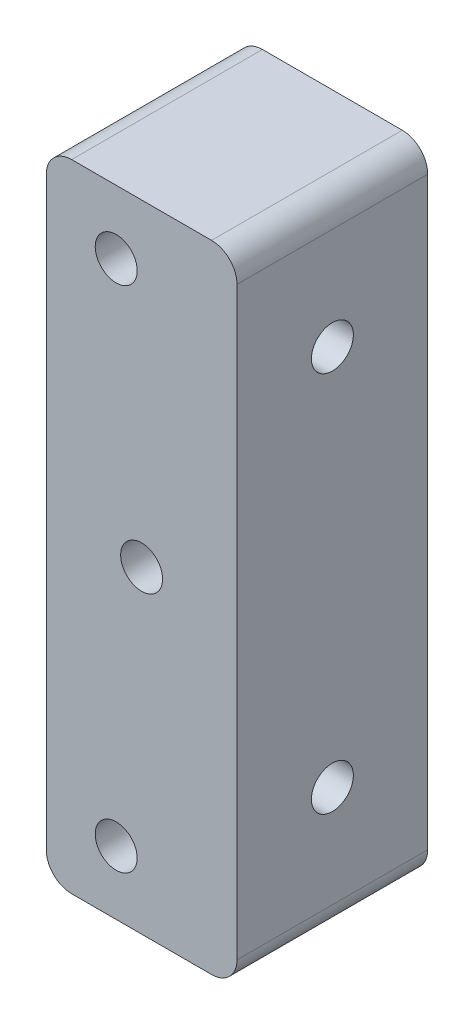
ISO-10303-21;
HEADER;
FILE_DESCRIPTION(('STEP AP214'),'2;1');
FILE_NAME('part.step','',(''),(''),'','','');
FILE_SCHEMA(('AUTOMOTIVE_DESIGN { 1 0 10303 214 1 1 1 1 }'));
ENDSEC;
DATA;
#1=APPLICATION_CONTEXT('core data for automotive mechanical design processes');
#2=APPLICATION_PROTOCOL_DEFINITION('international standard','automotive_design',2000,#1);
#3=PRODUCT_CONTEXT('',#1,'mechanical');
#4=PRODUCT('Part','Part','',(#3));
#5=PRODUCT_RELATED_PRODUCT_CATEGORY('part','',(#4));
#6=PRODUCT_DEFINITION_FORMATION('','',#4);
#7=PRODUCT_DEFINITION_CONTEXT('part definition',#1,'design');
#8=PRODUCT_DEFINITION('design','',#6,#7);
#9=PRODUCT_DEFINITION_SHAPE('','',#8);
#10=(LENGTH_UNIT() NAMED_UNIT(*) SI_UNIT(.MILLI.,.METRE.));
#11=(NAMED_UNIT(*) PLANE_ANGLE_UNIT() SI_UNIT($,.RADIAN.));
#12=(NAMED_UNIT(*) SI_UNIT($,.STERADIAN.) SOLID_ANGLE_UNIT());
#13=UNCERTAINTY_MEASURE_WITH_UNIT(LENGTH_MEASURE(1.E-05),#10,'distance_accuracy_value','');
#14=(GEOMETRIC_REPRESENTATION_CONTEXT(3) GLOBAL_UNCERTAINTY_ASSIGNED_CONTEXT((#13)) GLOBAL_UNIT_ASSIGNED_CONTEXT((#10,
#11,#12)) REPRESENTATION_CONTEXT('',''));
#15=CARTESIAN_POINT('',(0.,0.,0.));
#16=DIRECTION('',(0.,0.,1.));
#17=DIRECTION('',(1.,0.,0.));
#18=AXIS2_PLACEMENT_3D('',#15,#16,#17);
#19=CARTESIAN_POINT('',(0.,0.,15.));
#20=DIRECTION('',(0.,0.,-1.));
#21=DIRECTION('',(-1.,0.,0.));
#22=AXIS2_PLACEMENT_3D('',#19,#20,#21);
#23=PLANE('',#22);
#24=DIRECTION('',(1.,0.,0.));
#25=VECTOR('',#24,1.);
#26=CARTESIAN_POINT('',(0.,0.,15.));
#27=LINE('',#26,#25);
#28=CARTESIAN_POINT('',(2.,0.,15.));
#29=VERTEX_POINT('',#28);
#30=CARTESIAN_POINT('',(13.,0.,15.));
#31=VERTEX_POINT('',#30);
#32=EDGE_CURVE('E168',#29,#31,#27,.T.);
#33=ORIENTED_EDGE('',*,*,#32,.T.);
#34=CARTESIAN_POINT('',(13.,2.,15.));
#35=DIRECTION('',(0.,0.,-1.));
#36=DIRECTION('',(-1.,0.,0.));
#37=AXIS2_PLACEMENT_3D('',#34,#35,#36);
#38=CIRCLE('',#37,2.);
#39=CARTESIAN_POINT('',(15.,2.,15.));
#40=VERTEX_POINT('',#39);
#41=EDGE_CURVE('E148',#31,#40,#38,.F.);
#42=ORIENTED_EDGE('',*,*,#41,.T.);
#43=DIRECTION('',(0.,1.,0.));
#44=VECTOR('',#43,1.);
#45=CARTESIAN_POINT('',(15.,0.,15.));
#46=LINE('',#45,#44);
#47=CARTESIAN_POINT('',(15.,48.,15.));
#48=VERTEX_POINT('',#47);
#49=EDGE_CURVE('E118',#40,#48,#46,.T.);
#50=ORIENTED_EDGE('',*,*,#49,.T.);
#51=CARTESIAN_POINT('',(13.,48.,15.));
#52=DIRECTION('',(0.,0.,-1.));
#53=DIRECTION('',(-1.,0.,0.));
#54=AXIS2_PLACEMENT_3D('',#51,#52,#53);
#55=CIRCLE('',#54,2.);
#56=CARTESIAN_POINT('',(13.,50.,15.));
#57=VERTEX_POINT('',#56);
#58=EDGE_CURVE('E54',#48,#57,#55,.F.);
#59=ORIENTED_EDGE('',*,*,#58,.T.);
#60=DIRECTION('',(-1.,0.,0.));
#61=VECTOR('',#60,1.);
#62=CARTESIAN_POINT('',(0.,50.,15.));
#63=LINE('',#62,#61);
#64=CARTESIAN_POINT('',(2.,50.,15.));
#65=VERTEX_POINT('',#64);
#66=EDGE_CURVE('E135',#57,#65,#63,.T.);
#67=ORIENTED_EDGE('',*,*,#66,.T.);
#68=CARTESIAN_POINT('',(2.,48.,15.));
#69=DIRECTION('',(0.,0.,-1.));
#70=DIRECTION('',(-1.,0.,0.));
#71=AXIS2_PLACEMENT_3D('',#68,#69,#70);
#72=CIRCLE('',#71,2.);
#73=CARTESIAN_POINT('',(0.,48.,15.));
#74=VERTEX_POINT('',#73);
#75=EDGE_CURVE('E143',#65,#74,#72,.F.);
#76=ORIENTED_EDGE('',*,*,#75,.T.);
#77=DIRECTION('',(0.,-1.,0.));
#78=VECTOR('',#77,1.);
#79=CARTESIAN_POINT('',(0.,0.,15.));
#80=LINE('',#79,#78);
#81=CARTESIAN_POINT('',(0.,2.,15.));
#82=VERTEX_POINT('',#81);
#83=EDGE_CURVE('E129',#74,#82,#80,.T.);
#84=ORIENTED_EDGE('',*,*,#83,.T.);
#85=CARTESIAN_POINT('',(2.,2.,15.));
#86=DIRECTION('',(0.,0.,-1.));
#87=DIRECTION('',(-1.,0.,0.));
#88=AXIS2_PLACEMENT_3D('',#85,#86,#87);
#89=CIRCLE('',#88,2.);
#90=EDGE_CURVE('E146',#82,#29,#89,.F.);
#91=ORIENTED_EDGE('',*,*,#90,.T.);
#92=EDGE_LOOP('',(#33,#42,#50,#59,#67,#76,#84,#91));
#93=FACE_BOUND('',#92,.T.);
#94=CARTESIAN_POINT('',(5.5,5.,15.));
#95=DIRECTION('',(0.,0.,1.));
#96=DIRECTION('',(1.,0.,0.));
#97=AXIS2_PLACEMENT_3D('',#94,#95,#96);
#98=CIRCLE('',#97,1.65);
#99=CARTESIAN_POINT('',(7.15,5.,15.));
#100=VERTEX_POINT('',#99);
#101=EDGE_CURVE('E174',#100,#100,#98,.T.);
#102=ORIENTED_EDGE('',*,*,#101,.F.);
#103=EDGE_LOOP('',(#102));
#104=FACE_BOUND('',#103,.T.);
#105=CARTESIAN_POINT('',(5.5,45.,15.));
#106=DIRECTION('',(0.,0.,1.));
#107=DIRECTION('',(-1.,0.,0.));
#108=AXIS2_PLACEMENT_3D('',#105,#106,#107);
#109=CIRCLE('',#108,1.65);
#110=CARTESIAN_POINT('',(3.85,45.,15.));
#111=VERTEX_POINT('',#110);
#112=EDGE_CURVE('E183',#111,#111,#109,.T.);
#113=ORIENTED_EDGE('',*,*,#112,.F.);
#114=EDGE_LOOP('',(#113));
#115=FACE_BOUND('',#114,.T.);
#116=CARTESIAN_POINT('',(7.5,25.,15.));
#117=DIRECTION('',(0.,0.,1.));
#118=DIRECTION('',(1.,0.,0.));
#119=AXIS2_PLACEMENT_3D('',#116,#117,#118);
#120=CIRCLE('',#119,1.65);
#121=CARTESIAN_POINT('',(9.15,25.,15.));
#122=VERTEX_POINT('',#121);
#123=EDGE_CURVE('E188',#122,#122,#120,.T.);
#124=ORIENTED_EDGE('',*,*,#123,.F.);
#125=EDGE_LOOP('',(#124));
#126=FACE_BOUND('',#125,.T.);
#127=ADVANCED_FACE('F33',(#93,#104,#115,#126),#23,.F.);
#128=CARTESIAN_POINT('',(0.,0.,0.));
#129=DIRECTION('',(0.,0.,-1.));
#130=DIRECTION('',(-1.,0.,0.));
#131=AXIS2_PLACEMENT_3D('',#128,#129,#130);
#132=PLANE('',#131);
#133=CARTESIAN_POINT('',(5.5,45.,0.));
#134=DIRECTION('',(0.,0.,1.));
#135=DIRECTION('',(-1.,0.,0.));
#136=AXIS2_PLACEMENT_3D('',#133,#134,#135);
#137=CIRCLE('',#136,1.65);
#138=CARTESIAN_POINT('',(3.85,45.,0.));
#139=VERTEX_POINT('',#138);
#140=EDGE_CURVE('E185',#139,#139,#137,.T.);
#141=ORIENTED_EDGE('',*,*,#140,.T.);
#142=EDGE_LOOP('',(#141));
#143=FACE_BOUND('',#142,.T.);
#144=DIRECTION('',(0.,1.,0.));
#145=VECTOR('',#144,1.);
#146=CARTESIAN_POINT('',(15.,0.,0.));
#147=LINE('',#146,#145);
#148=CARTESIAN_POINT('',(15.,2.,0.));
#149=VERTEX_POINT('',#148);
#150=CARTESIAN_POINT('',(15.,48.,0.));
#151=VERTEX_POINT('',#150);
#152=EDGE_CURVE('E116',#149,#151,#147,.T.);
#153=ORIENTED_EDGE('',*,*,#152,.F.);
#154=CARTESIAN_POINT('',(13.,2.,0.));
#155=DIRECTION('',(0.,0.,-1.));
#156=DIRECTION('',(-1.,0.,0.));
#157=AXIS2_PLACEMENT_3D('',#154,#155,#156);
#158=CIRCLE('',#157,2.);
#159=CARTESIAN_POINT('',(13.,0.,0.));
#160=VERTEX_POINT('',#159);
#161=EDGE_CURVE('E99',#149,#160,#158,.T.);
#162=ORIENTED_EDGE('',*,*,#161,.T.);
#163=DIRECTION('',(1.,0.,0.));
#164=VECTOR('',#163,1.);
#165=CARTESIAN_POINT('',(0.,0.,0.));
#166=LINE('',#165,#164);
#167=CARTESIAN_POINT('',(2.,0.,0.));
#168=VERTEX_POINT('',#167);
#169=EDGE_CURVE('E127',#168,#160,#166,.T.);
#170=ORIENTED_EDGE('',*,*,#169,.F.);
#171=CARTESIAN_POINT('',(2.,2.,0.));
#172=DIRECTION('',(0.,0.,-1.));
#173=DIRECTION('',(-1.,0.,0.));
#174=AXIS2_PLACEMENT_3D('',#171,#172,#173);
#175=CIRCLE('',#174,2.);
#176=CARTESIAN_POINT('',(0.,2.,0.));
#177=VERTEX_POINT('',#176);
#178=EDGE_CURVE('E110',#168,#177,#175,.T.);
#179=ORIENTED_EDGE('',*,*,#178,.T.);
#180=DIRECTION('',(0.,-1.,0.));
#181=VECTOR('',#180,1.);
#182=CARTESIAN_POINT('',(0.,0.,0.));
#183=LINE('',#182,#181);
#184=CARTESIAN_POINT('',(0.,48.,0.));
#185=VERTEX_POINT('',#184);
#186=EDGE_CURVE('E131',#185,#177,#183,.T.);
#187=ORIENTED_EDGE('',*,*,#186,.F.);
#188=CARTESIAN_POINT('',(2.,48.,0.));
#189=DIRECTION('',(0.,0.,-1.));
#190=DIRECTION('',(-1.,0.,0.));
#191=AXIS2_PLACEMENT_3D('',#188,#189,#190);
#192=CIRCLE('',#191,2.);
#193=CARTESIAN_POINT('',(2.,50.,0.));
#194=VERTEX_POINT('',#193);
#195=EDGE_CURVE('E119',#185,#194,#192,.T.);
#196=ORIENTED_EDGE('',*,*,#195,.T.);
#197=DIRECTION('',(-1.,0.,0.));
#198=VECTOR('',#197,1.);
#199=CARTESIAN_POINT('',(0.,50.,0.));
#200=LINE('',#199,#198);
#201=CARTESIAN_POINT('',(13.,50.,0.));
#202=VERTEX_POINT('',#201);
#203=EDGE_CURVE('E126',#202,#194,#200,.T.);
#204=ORIENTED_EDGE('',*,*,#203,.F.);
#205=CARTESIAN_POINT('',(13.,48.,0.));
#206=DIRECTION('',(0.,0.,-1.));
#207=DIRECTION('',(-1.,0.,0.));
#208=AXIS2_PLACEMENT_3D('',#205,#206,#207);
#209=CIRCLE('',#208,2.);
#210=EDGE_CURVE('E125',#202,#151,#209,.T.);
#211=ORIENTED_EDGE('',*,*,#210,.T.);
#212=EDGE_LOOP('',(#153,#162,#170,#179,#187,#196,#204,#211));
#213=FACE_BOUND('',#212,.T.);
#214=CARTESIAN_POINT('',(5.5,5.,0.));
#215=DIRECTION('',(0.,0.,1.));
#216=DIRECTION('',(1.,0.,0.));
#217=AXIS2_PLACEMENT_3D('',#214,#215,#216);
#218=CIRCLE('',#217,1.65);
#219=CARTESIAN_POINT('',(7.15,5.,0.));
#220=VERTEX_POINT('',#219);
#221=EDGE_CURVE('E176',#220,#220,#218,.T.);
#222=ORIENTED_EDGE('',*,*,#221,.T.);
#223=EDGE_LOOP('',(#222));
#224=FACE_BOUND('',#223,.T.);
#225=CARTESIAN_POINT('',(7.5,25.,0.));
#226=DIRECTION('',(0.,0.,1.));
#227=DIRECTION('',(1.,0.,0.));
#228=AXIS2_PLACEMENT_3D('',#225,#226,#227);
#229=CIRCLE('',#228,1.65);
#230=CARTESIAN_POINT('',(9.15,25.,0.));
#231=VERTEX_POINT('',#230);
#232=EDGE_CURVE('E191',#231,#231,#229,.T.);
#233=ORIENTED_EDGE('',*,*,#232,.T.);
#234=EDGE_LOOP('',(#233));
#235=FACE_BOUND('',#234,.T.);
#236=ADVANCED_FACE('F122',(#143,#213,#224,#235),#132,.T.);
#237=CARTESIAN_POINT('',(0.,0.,15.));
#238=DIRECTION('',(1.,0.,0.));
#239=DIRECTION('',(0.,0.,-1.));
#240=AXIS2_PLACEMENT_3D('',#237,#238,#239);
#241=PLANE('',#240);
#242=CARTESIAN_POINT('',(0.,40.,7.49999999999999));
#243=DIRECTION('',(-1.,0.,0.));
#244=DIRECTION('',(0.,0.,1.));
#245=AXIS2_PLACEMENT_3D('',#242,#243,#244);
#246=CIRCLE('',#245,1.65);
#247=CARTESIAN_POINT('',(0.,40.,9.14999999999999));
#248=VERTEX_POINT('',#247);
#249=EDGE_CURVE('E200',#248,#248,#246,.T.);
#250=ORIENTED_EDGE('',*,*,#249,.F.);
#251=EDGE_LOOP('',(#250));
#252=FACE_BOUND('',#251,.T.);
#253=CARTESIAN_POINT('',(0.,10.,7.5));
#254=DIRECTION('',(-1.,0.,0.));
#255=DIRECTION('',(0.,0.,-1.));
#256=AXIS2_PLACEMENT_3D('',#253,#254,#255);
#257=CIRCLE('',#256,1.65);
#258=CARTESIAN_POINT('',(0.,10.,5.85));
#259=VERTEX_POINT('',#258);
#260=EDGE_CURVE('E201',#259,#259,#257,.T.);
#261=ORIENTED_EDGE('',*,*,#260,.F.);
#262=EDGE_LOOP('',(#261));
#263=FACE_BOUND('',#262,.T.);
#264=ORIENTED_EDGE('',*,*,#186,.T.);
#265=DIRECTION('',(0.,0.,-1.));
#266=VECTOR('',#265,1.);
#267=CARTESIAN_POINT('',(0.,2.,15.));
#268=LINE('',#267,#266);
#269=EDGE_CURVE('E153',#177,#82,#268,.F.);
#270=ORIENTED_EDGE('',*,*,#269,.T.);
#271=ORIENTED_EDGE('',*,*,#83,.F.);
#272=DIRECTION('',(0.,0.,-1.));
#273=VECTOR('',#272,1.);
#274=CARTESIAN_POINT('',(0.,48.,15.));
#275=LINE('',#274,#273);
#276=EDGE_CURVE('E150',#74,#185,#275,.T.);
#277=ORIENTED_EDGE('',*,*,#276,.T.);
#278=EDGE_LOOP('',(#264,#270,#271,#277));
#279=FACE_BOUND('',#278,.T.);
#280=ADVANCED_FACE('F159',(#252,#263,#279),#241,.F.);
#281=CARTESIAN_POINT('',(0.,0.,15.));
#282=DIRECTION('',(0.,1.,0.));
#283=DIRECTION('',(0.,0.,1.));
#284=AXIS2_PLACEMENT_3D('',#281,#282,#283);
#285=PLANE('',#284);
#286=ORIENTED_EDGE('',*,*,#169,.T.);
#287=DIRECTION('',(0.,0.,-1.));
#288=VECTOR('',#287,1.);
#289=CARTESIAN_POINT('',(13.,0.,15.));
#290=LINE('',#289,#288);
#291=EDGE_CURVE('E104',#160,#31,#290,.F.);
#292=ORIENTED_EDGE('',*,*,#291,.T.);
#293=ORIENTED_EDGE('',*,*,#32,.F.);
#294=DIRECTION('',(0.,0.,-1.));
#295=VECTOR('',#294,1.);
#296=CARTESIAN_POINT('',(2.,0.,15.));
#297=LINE('',#296,#295);
#298=EDGE_CURVE('E109',#29,#168,#297,.T.);
#299=ORIENTED_EDGE('',*,*,#298,.T.);
#300=EDGE_LOOP('',(#286,#292,#293,#299));
#301=FACE_BOUND('',#300,.T.);
#302=ADVANCED_FACE('F173',(#301),#285,.F.);
#303=CARTESIAN_POINT('',(15.,0.,15.));
#304=DIRECTION('',(-1.,0.,0.));
#305=DIRECTION('',(0.,0.,1.));
#306=AXIS2_PLACEMENT_3D('',#303,#304,#305);
#307=PLANE('',#306);
#308=CARTESIAN_POINT('',(15.,40.,7.49999999999999));
#309=DIRECTION('',(-1.,0.,0.));
#310=DIRECTION('',(0.,0.,1.));
#311=AXIS2_PLACEMENT_3D('',#308,#309,#310);
#312=CIRCLE('',#311,1.65);
#313=CARTESIAN_POINT('',(15.,40.,9.14999999999999));
#314=VERTEX_POINT('',#313);
#315=EDGE_CURVE('E194',#314,#314,#312,.F.);
#316=ORIENTED_EDGE('',*,*,#315,.F.);
#317=EDGE_LOOP('',(#316));
#318=FACE_BOUND('',#317,.T.);
#319=CARTESIAN_POINT('',(15.,10.,7.5));
#320=DIRECTION('',(-1.,0.,0.));
#321=DIRECTION('',(0.,0.,1.));
#322=AXIS2_PLACEMENT_3D('',#319,#320,#321);
#323=CIRCLE('',#322,1.65);
#324=CARTESIAN_POINT('',(15.,10.,9.15));
#325=VERTEX_POINT('',#324);
#326=EDGE_CURVE('E197',#325,#325,#323,.F.);
#327=ORIENTED_EDGE('',*,*,#326,.F.);
#328=EDGE_LOOP('',(#327));
#329=FACE_BOUND('',#328,.T.);
#330=ORIENTED_EDGE('',*,*,#49,.F.);
#331=DIRECTION('',(0.,0.,-1.));
#332=VECTOR('',#331,1.);
#333=CARTESIAN_POINT('',(15.,2.,15.));
#334=LINE('',#333,#332);
#335=EDGE_CURVE('E103',#40,#149,#334,.T.);
#336=ORIENTED_EDGE('',*,*,#335,.T.);
#337=ORIENTED_EDGE('',*,*,#152,.T.);
#338=DIRECTION('',(0.,0.,-1.));
#339=VECTOR('',#338,1.);
#340=CARTESIAN_POINT('',(15.,48.,15.));
#341=LINE('',#340,#339);
#342=EDGE_CURVE('E120',#151,#48,#341,.F.);
#343=ORIENTED_EDGE('',*,*,#342,.T.);
#344=EDGE_LOOP('',(#330,#336,#337,#343));
#345=FACE_BOUND('',#344,.T.);
#346=ADVANCED_FACE('F115',(#318,#329,#345),#307,.F.);
#347=CARTESIAN_POINT('',(0.,50.,15.));
#348=DIRECTION('',(0.,-1.,0.));
#349=DIRECTION('',(0.,0.,-1.));
#350=AXIS2_PLACEMENT_3D('',#347,#348,#349);
#351=PLANE('',#350);
#352=ORIENTED_EDGE('',*,*,#66,.F.);
#353=DIRECTION('',(0.,0.,-1.));
#354=VECTOR('',#353,1.);
#355=CARTESIAN_POINT('',(13.,50.,15.));
#356=LINE('',#355,#354);
#357=EDGE_CURVE('E11',#57,#202,#356,.T.);
#358=ORIENTED_EDGE('',*,*,#357,.T.);
#359=ORIENTED_EDGE('',*,*,#203,.T.);
#360=DIRECTION('',(0.,0.,-1.));
#361=VECTOR('',#360,1.);
#362=CARTESIAN_POINT('',(2.,50.,15.));
#363=LINE('',#362,#361);
#364=EDGE_CURVE('E41',#194,#65,#363,.F.);
#365=ORIENTED_EDGE('',*,*,#364,.T.);
#366=EDGE_LOOP('',(#352,#358,#359,#365));
#367=FACE_BOUND('',#366,.T.);
#368=ADVANCED_FACE('F241',(#367),#351,.F.);
#369=CARTESIAN_POINT('',(5.5,5.,15.));
#370=DIRECTION('',(0.,0.,-1.));
#371=DIRECTION('',(-1.,0.,0.));
#372=AXIS2_PLACEMENT_3D('',#369,#370,#371);
#373=CYLINDRICAL_SURFACE('',#372,1.65);
#374=ORIENTED_EDGE('',*,*,#101,.T.);
#375=EDGE_LOOP('',(#374));
#376=FACE_BOUND('',#375,.T.);
#377=ORIENTED_EDGE('',*,*,#221,.F.);
#378=EDGE_LOOP('',(#377));
#379=FACE_BOUND('',#378,.T.);
#380=ADVANCED_FACE('F238',(#376,#379),#373,.F.);
#381=CARTESIAN_POINT('',(5.5,45.,15.));
#382=DIRECTION('',(0.,0.,-1.));
#383=DIRECTION('',(-1.,0.,0.));
#384=AXIS2_PLACEMENT_3D('',#381,#382,#383);
#385=CYLINDRICAL_SURFACE('',#384,1.65);
#386=ORIENTED_EDGE('',*,*,#112,.T.);
#387=EDGE_LOOP('',(#386));
#388=FACE_BOUND('',#387,.T.);
#389=ORIENTED_EDGE('',*,*,#140,.F.);
#390=EDGE_LOOP('',(#389));
#391=FACE_BOUND('',#390,.T.);
#392=ADVANCED_FACE('F227',(#388,#391),#385,.F.);
#393=CARTESIAN_POINT('',(7.5,25.,15.));
#394=DIRECTION('',(0.,0.,-1.));
#395=DIRECTION('',(-1.,0.,0.));
#396=AXIS2_PLACEMENT_3D('',#393,#394,#395);
#397=CYLINDRICAL_SURFACE('',#396,1.65);
#398=ORIENTED_EDGE('',*,*,#123,.T.);
#399=EDGE_LOOP('',(#398));
#400=FACE_BOUND('',#399,.T.);
#401=ORIENTED_EDGE('',*,*,#232,.F.);
#402=EDGE_LOOP('',(#401));
#403=FACE_BOUND('',#402,.T.);
#404=ADVANCED_FACE('F218',(#400,#403),#397,.F.);
#405=CARTESIAN_POINT('',(19.6669047558312,10.,7.5));
#406=DIRECTION('',(-1.,0.,0.));
#407=DIRECTION('',(0.,0.,1.));
#408=AXIS2_PLACEMENT_3D('',#405,#406,#407);
#409=CYLINDRICAL_SURFACE('',#408,1.65);
#410=ORIENTED_EDGE('',*,*,#326,.T.);
#411=EDGE_LOOP('',(#410));
#412=FACE_BOUND('',#411,.T.);
#413=ORIENTED_EDGE('',*,*,#260,.T.);
#414=EDGE_LOOP('',(#413));
#415=FACE_BOUND('',#414,.T.);
#416=ADVANCED_FACE('F216',(#412,#415),#409,.F.);
#417=CARTESIAN_POINT('',(19.6669047558312,40.,7.49999999999999));
#418=DIRECTION('',(-1.,0.,0.));
#419=DIRECTION('',(0.,0.,1.));
#420=AXIS2_PLACEMENT_3D('',#417,#418,#419);
#421=CYLINDRICAL_SURFACE('',#420,1.65);
#422=ORIENTED_EDGE('',*,*,#315,.T.);
#423=EDGE_LOOP('',(#422));
#424=FACE_BOUND('',#423,.T.);
#425=ORIENTED_EDGE('',*,*,#249,.T.);
#426=EDGE_LOOP('',(#425));
#427=FACE_BOUND('',#426,.T.);
#428=ADVANCED_FACE('F209',(#424,#427),#421,.F.);
#429=CARTESIAN_POINT('',(13.,2.,15.));
#430=DIRECTION('',(0.,0.,-1.));
#431=DIRECTION('',(-1.,0.,0.));
#432=AXIS2_PLACEMENT_3D('',#429,#430,#431);
#433=CYLINDRICAL_SURFACE('',#432,2.);
#434=ORIENTED_EDGE('',*,*,#41,.F.);
#435=ORIENTED_EDGE('',*,*,#291,.F.);
#436=ORIENTED_EDGE('',*,*,#161,.F.);
#437=ORIENTED_EDGE('',*,*,#335,.F.);
#438=EDGE_LOOP('',(#434,#435,#436,#437));
#439=FACE_BOUND('',#438,.T.);
#440=ADVANCED_FACE('F102',(#439),#433,.T.);
#441=CARTESIAN_POINT('',(2.,2.,15.));
#442=DIRECTION('',(0.,0.,-1.));
#443=DIRECTION('',(-1.,0.,0.));
#444=AXIS2_PLACEMENT_3D('',#441,#442,#443);
#445=CYLINDRICAL_SURFACE('',#444,2.);
#446=ORIENTED_EDGE('',*,*,#90,.F.);
#447=ORIENTED_EDGE('',*,*,#269,.F.);
#448=ORIENTED_EDGE('',*,*,#178,.F.);
#449=ORIENTED_EDGE('',*,*,#298,.F.);
#450=EDGE_LOOP('',(#446,#447,#448,#449));
#451=FACE_BOUND('',#450,.T.);
#452=ADVANCED_FACE('F171',(#451),#445,.T.);
#453=CARTESIAN_POINT('',(13.,48.,15.));
#454=DIRECTION('',(0.,0.,-1.));
#455=DIRECTION('',(-1.,0.,0.));
#456=AXIS2_PLACEMENT_3D('',#453,#454,#455);
#457=CYLINDRICAL_SURFACE('',#456,2.);
#458=ORIENTED_EDGE('',*,*,#58,.F.);
#459=ORIENTED_EDGE('',*,*,#342,.F.);
#460=ORIENTED_EDGE('',*,*,#210,.F.);
#461=ORIENTED_EDGE('',*,*,#357,.F.);
#462=EDGE_LOOP('',(#458,#459,#460,#461));
#463=FACE_BOUND('',#462,.T.);
#464=ADVANCED_FACE('F252',(#463),#457,.T.);
#465=CARTESIAN_POINT('',(2.,48.,15.));
#466=DIRECTION('',(0.,0.,-1.));
#467=DIRECTION('',(-1.,0.,0.));
#468=AXIS2_PLACEMENT_3D('',#465,#466,#467);
#469=CYLINDRICAL_SURFACE('',#468,2.);
#470=ORIENTED_EDGE('',*,*,#75,.F.);
#471=ORIENTED_EDGE('',*,*,#364,.F.);
#472=ORIENTED_EDGE('',*,*,#195,.F.);
#473=ORIENTED_EDGE('',*,*,#276,.F.);
#474=EDGE_LOOP('',(#470,#471,#472,#473));
#475=FACE_BOUND('',#474,.T.);
#476=ADVANCED_FACE('F35',(#475),#469,.T.);
#477=CLOSED_SHELL('',(#127,#236,#280,#302,#346,#368,#380,#392,#404,#416,#428,#440,#452,#464,#476));
#478=MANIFOLD_SOLID_BREP('B2',#477);
#479=ADVANCED_BREP_SHAPE_REPRESENTATION('',(#18,#478),#14);
#480=SHAPE_DEFINITION_REPRESENTATION(#9,#479);
ENDSEC;
END-ISO-10303-21;
